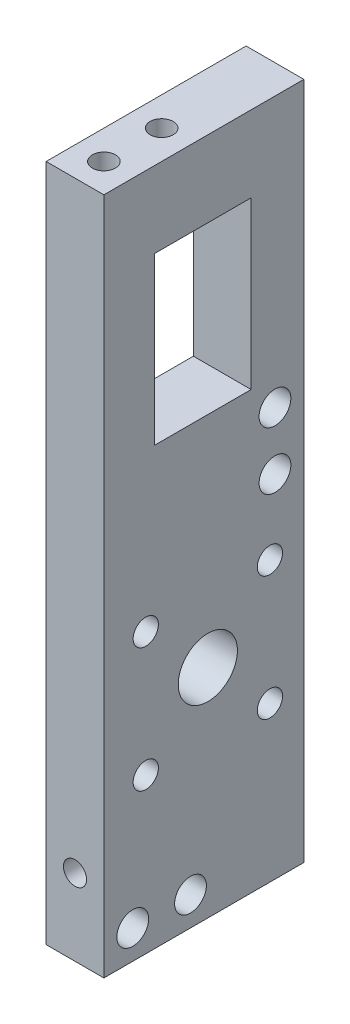
ISO-10303-21;
HEADER;
FILE_DESCRIPTION(('STEP AP214'),'2;1');
FILE_NAME('part.step','',(''),(''),'','','');
FILE_SCHEMA(('AUTOMOTIVE_DESIGN { 1 0 10303 214 1 1 1 1 }'));
ENDSEC;
DATA;
#1=APPLICATION_CONTEXT('core data for automotive mechanical design processes');
#2=APPLICATION_PROTOCOL_DEFINITION('international standard','automotive_design',2000,#1);
#3=PRODUCT_CONTEXT('',#1,'mechanical');
#4=PRODUCT('Part','Part','',(#3));
#5=PRODUCT_RELATED_PRODUCT_CATEGORY('part','',(#4));
#6=PRODUCT_DEFINITION_FORMATION('','',#4);
#7=PRODUCT_DEFINITION_CONTEXT('part definition',#1,'design');
#8=PRODUCT_DEFINITION('design','',#6,#7);
#9=PRODUCT_DEFINITION_SHAPE('','',#8);
#10=(LENGTH_UNIT() NAMED_UNIT(*) SI_UNIT(.MILLI.,.METRE.));
#11=(NAMED_UNIT(*) PLANE_ANGLE_UNIT() SI_UNIT($,.RADIAN.));
#12=(NAMED_UNIT(*) SI_UNIT($,.STERADIAN.) SOLID_ANGLE_UNIT());
#13=UNCERTAINTY_MEASURE_WITH_UNIT(LENGTH_MEASURE(1.E-05),#10,'distance_accuracy_value','');
#14=(GEOMETRIC_REPRESENTATION_CONTEXT(3) GLOBAL_UNCERTAINTY_ASSIGNED_CONTEXT((#13)) GLOBAL_UNIT_ASSIGNED_CONTEXT((#10,
#11,#12)) REPRESENTATION_CONTEXT('',''));
#15=CARTESIAN_POINT('',(0.,0.,0.));
#16=DIRECTION('',(0.,0.,1.));
#17=DIRECTION('',(1.,0.,0.));
#18=AXIS2_PLACEMENT_3D('',#15,#16,#17);
#19=CARTESIAN_POINT('',(49.65,-4.3,11.1));
#20=DIRECTION('',(1.,0.,0.));
#21=DIRECTION('',(0.,0.,-1.));
#22=AXIS2_PLACEMENT_3D('',#19,#20,#21);
#23=PLANE('',#22);
#24=CARTESIAN_POINT('',(49.65,20.,-0.75));
#25=DIRECTION('',(1.,0.,0.));
#26=DIRECTION('',(0.,0.,-1.));
#27=AXIS2_PLACEMENT_3D('',#24,#25,#26);
#28=CIRCLE('',#27,1.1);
#29=CARTESIAN_POINT('',(49.65,20.,-1.85));
#30=VERTEX_POINT('',#29);
#31=EDGE_CURVE('E131',#30,#30,#28,.T.);
#32=ORIENTED_EDGE('',*,*,#31,.T.);
#33=EDGE_LOOP('',(#32));
#34=FACE_BOUND('',#33,.T.);
#35=CARTESIAN_POINT('',(49.65,24.,-0.75));
#36=DIRECTION('',(1.,0.,0.));
#37=DIRECTION('',(0.,0.,-1.));
#38=AXIS2_PLACEMENT_3D('',#35,#36,#37);
#39=CIRCLE('',#38,1.1);
#40=CARTESIAN_POINT('',(49.65,24.,-1.85));
#41=VERTEX_POINT('',#40);
#42=EDGE_CURVE('E134',#41,#41,#39,.T.);
#43=ORIENTED_EDGE('',*,*,#42,.T.);
#44=EDGE_LOOP('',(#43));
#45=FACE_BOUND('',#44,.T.);
#46=CARTESIAN_POINT('',(49.65,6.425,-0.4005036727));
#47=DIRECTION('',(1.,0.,0.));
#48=DIRECTION('',(0.,0.,-1.));
#49=AXIS2_PLACEMENT_3D('',#46,#47,#48);
#50=CIRCLE('',#49,0.875);
#51=CARTESIAN_POINT('',(49.65,6.425,-1.2755036727));
#52=VERTEX_POINT('',#51);
#53=EDGE_CURVE('E150',#52,#52,#50,.T.);
#54=ORIENTED_EDGE('',*,*,#53,.T.);
#55=EDGE_LOOP('',(#54));
#56=FACE_BOUND('',#55,.T.);
#57=CARTESIAN_POINT('',(49.65,15.025,-0.4005036727));
#58=DIRECTION('',(1.,0.,0.));
#59=DIRECTION('',(0.,0.,-1.));
#60=AXIS2_PLACEMENT_3D('',#57,#58,#59);
#61=CIRCLE('',#60,0.875);
#62=CARTESIAN_POINT('',(49.65,15.025,-1.2755036727));
#63=VERTEX_POINT('',#62);
#64=EDGE_CURVE('E145',#63,#63,#61,.T.);
#65=ORIENTED_EDGE('',*,*,#64,.T.);
#66=EDGE_LOOP('',(#65));
#67=FACE_BOUND('',#66,.T.);
#68=CARTESIAN_POINT('',(49.65,10.725,3.8994963273));
#69=DIRECTION('',(1.,0.,0.));
#70=DIRECTION('',(0.,0.,-1.));
#71=AXIS2_PLACEMENT_3D('',#68,#69,#70);
#72=CIRCLE('',#71,2.05);
#73=CARTESIAN_POINT('',(49.65,10.725,1.8494963273));
#74=VERTEX_POINT('',#73);
#75=EDGE_CURVE('E215',#74,#74,#72,.T.);
#76=ORIENTED_EDGE('',*,*,#75,.T.);
#77=EDGE_LOOP('',(#76));
#78=FACE_BOUND('',#77,.T.);
#79=DIRECTION('',(0.,0.,-1.));
#80=VECTOR('',#79,1.);
#81=CARTESIAN_POINT('',(49.65,25.9,0.9));
#82=LINE('',#81,#80);
#83=CARTESIAN_POINT('',(49.65,25.9,7.6));
#84=VERTEX_POINT('',#83);
#85=CARTESIAN_POINT('',(49.65,25.9,0.9));
#86=VERTEX_POINT('',#85);
#87=EDGE_CURVE('E194',#84,#86,#82,.T.);
#88=ORIENTED_EDGE('',*,*,#87,.T.);
#89=DIRECTION('',(0.,1.,0.));
#90=VECTOR('',#89,1.);
#91=CARTESIAN_POINT('',(49.65,-4.3,0.9));
#92=LINE('',#91,#90);
#93=CARTESIAN_POINT('',(49.65,37.4,0.9));
#94=VERTEX_POINT('',#93);
#95=EDGE_CURVE('E138',#86,#94,#92,.T.);
#96=ORIENTED_EDGE('',*,*,#95,.T.);
#97=DIRECTION('',(0.,0.,1.));
#98=VECTOR('',#97,1.);
#99=CARTESIAN_POINT('',(49.65,37.4,0.9));
#100=LINE('',#99,#98);
#101=CARTESIAN_POINT('',(49.65,37.4,7.6));
#102=VERTEX_POINT('',#101);
#103=EDGE_CURVE('E122',#94,#102,#100,.T.);
#104=ORIENTED_EDGE('',*,*,#103,.T.);
#105=DIRECTION('',(0.,-1.,0.));
#106=VECTOR('',#105,1.);
#107=CARTESIAN_POINT('',(49.65,25.9,7.6));
#108=LINE('',#107,#106);
#109=EDGE_CURVE('E190',#102,#84,#108,.T.);
#110=ORIENTED_EDGE('',*,*,#109,.T.);
#111=EDGE_LOOP('',(#88,#96,#104,#110));
#112=FACE_BOUND('',#111,.T.);
#113=CARTESIAN_POINT('',(49.65,-2.3,5.1));
#114=DIRECTION('',(1.,0.,0.));
#115=DIRECTION('',(0.,0.,-1.));
#116=AXIS2_PLACEMENT_3D('',#113,#114,#115);
#117=CIRCLE('',#116,1.1);
#118=CARTESIAN_POINT('',(49.65,-2.3,4.));
#119=VERTEX_POINT('',#118);
#120=EDGE_CURVE('E178',#119,#119,#117,.T.);
#121=ORIENTED_EDGE('',*,*,#120,.T.);
#122=EDGE_LOOP('',(#121));
#123=FACE_BOUND('',#122,.T.);
#124=CARTESIAN_POINT('',(49.65,-2.3,9.1));
#125=DIRECTION('',(1.,0.,0.));
#126=DIRECTION('',(0.,0.,-1.));
#127=AXIS2_PLACEMENT_3D('',#124,#125,#126);
#128=CIRCLE('',#127,1.1);
#129=CARTESIAN_POINT('',(49.65,-2.3,8.));
#130=VERTEX_POINT('',#129);
#131=EDGE_CURVE('E169',#130,#130,#128,.T.);
#132=ORIENTED_EDGE('',*,*,#131,.T.);
#133=EDGE_LOOP('',(#132));
#134=FACE_BOUND('',#133,.T.);
#135=CARTESIAN_POINT('',(49.65,6.425,8.1994963273));
#136=DIRECTION('',(1.,0.,0.));
#137=DIRECTION('',(0.,0.,-1.));
#138=AXIS2_PLACEMENT_3D('',#135,#136,#137);
#139=CIRCLE('',#138,0.875);
#140=CARTESIAN_POINT('',(49.65,6.425,7.3244963273));
#141=VERTEX_POINT('',#140);
#142=EDGE_CURVE('E203',#141,#141,#139,.T.);
#143=ORIENTED_EDGE('',*,*,#142,.T.);
#144=EDGE_LOOP('',(#143));
#145=FACE_BOUND('',#144,.T.);
#146=CARTESIAN_POINT('',(49.65,15.025,8.1994963273));
#147=DIRECTION('',(1.,0.,0.));
#148=DIRECTION('',(0.,0.,-1.));
#149=AXIS2_PLACEMENT_3D('',#146,#147,#148);
#150=CIRCLE('',#149,0.875);
#151=CARTESIAN_POINT('',(49.65,15.025,7.3244963273));
#152=VERTEX_POINT('',#151);
#153=EDGE_CURVE('E201',#152,#152,#150,.T.);
#154=ORIENTED_EDGE('',*,*,#153,.T.);
#155=EDGE_LOOP('',(#154));
#156=FACE_BOUND('',#155,.T.);
#157=DIRECTION('',(0.,0.,-1.));
#158=VECTOR('',#157,1.);
#159=CARTESIAN_POINT('',(49.65,42.68,11.1));
#160=LINE('',#159,#158);
#161=CARTESIAN_POINT('',(49.65,42.68,11.1));
#162=VERTEX_POINT('',#161);
#163=CARTESIAN_POINT('',(49.65,42.68,-2.751909565512));
#164=VERTEX_POINT('',#163);
#165=EDGE_CURVE('E232',#162,#164,#160,.T.);
#166=ORIENTED_EDGE('',*,*,#165,.T.);
#167=DIRECTION('',(0.,1.,0.));
#168=VECTOR('',#167,1.);
#169=CARTESIAN_POINT('',(49.65,-4.3,-2.751909565512));
#170=LINE('',#169,#168);
#171=CARTESIAN_POINT('',(49.65,-4.3,-2.751909565512));
#172=VERTEX_POINT('',#171);
#173=EDGE_CURVE('E153',#172,#164,#170,.T.);
#174=ORIENTED_EDGE('',*,*,#173,.F.);
#175=DIRECTION('',(0.,0.,-1.));
#176=VECTOR('',#175,1.);
#177=CARTESIAN_POINT('',(49.65,-4.3,11.1));
#178=LINE('',#177,#176);
#179=CARTESIAN_POINT('',(49.65,-4.3,11.1));
#180=VERTEX_POINT('',#179);
#181=EDGE_CURVE('E52',#180,#172,#178,.T.);
#182=ORIENTED_EDGE('',*,*,#181,.F.);
#183=DIRECTION('',(0.,-1.,0.));
#184=VECTOR('',#183,1.);
#185=CARTESIAN_POINT('',(49.65,-4.3,11.1));
#186=LINE('',#185,#184);
#187=EDGE_CURVE('E224',#162,#180,#186,.T.);
#188=ORIENTED_EDGE('',*,*,#187,.F.);
#189=EDGE_LOOP('',(#166,#174,#182,#188));
#190=FACE_BOUND('',#189,.T.);
#191=ADVANCED_FACE('F45',(#34,#45,#56,#67,#78,#112,#123,#134,#145,#156,#190),#23,.F.);
#192=CARTESIAN_POINT('',(49.65,-4.3,11.1));
#193=DIRECTION('',(0.,1.,0.));
#194=DIRECTION('',(0.,0.,1.));
#195=AXIS2_PLACEMENT_3D('',#192,#193,#194);
#196=PLANE('',#195);
#197=ORIENTED_EDGE('',*,*,#181,.T.);
#198=DIRECTION('',(-1.,0.,0.));
#199=VECTOR('',#198,1.);
#200=CARTESIAN_POINT('',(49.65,-4.3,-2.751909565512));
#201=LINE('',#200,#199);
#202=CARTESIAN_POINT('',(53.65,-4.3,-2.751909565512));
#203=VERTEX_POINT('',#202);
#204=EDGE_CURVE('E162',#203,#172,#201,.T.);
#205=ORIENTED_EDGE('',*,*,#204,.F.);
#206=DIRECTION('',(0.,0.,-1.));
#207=VECTOR('',#206,1.);
#208=CARTESIAN_POINT('',(53.65,-4.3,11.1));
#209=LINE('',#208,#207);
#210=CARTESIAN_POINT('',(53.65,-4.3,11.1));
#211=VERTEX_POINT('',#210);
#212=EDGE_CURVE('E236',#211,#203,#209,.T.);
#213=ORIENTED_EDGE('',*,*,#212,.F.);
#214=DIRECTION('',(1.,0.,0.));
#215=VECTOR('',#214,1.);
#216=CARTESIAN_POINT('',(49.65,-4.3,11.1));
#217=LINE('',#216,#215);
#218=EDGE_CURVE('E228',#180,#211,#217,.T.);
#219=ORIENTED_EDGE('',*,*,#218,.F.);
#220=EDGE_LOOP('',(#197,#205,#213,#219));
#221=FACE_BOUND('',#220,.T.);
#222=ADVANCED_FACE('F240',(#221),#196,.F.);
#223=CARTESIAN_POINT('',(53.65,-4.3,11.1));
#224=DIRECTION('',(-1.,0.,0.));
#225=DIRECTION('',(0.,0.,1.));
#226=AXIS2_PLACEMENT_3D('',#223,#224,#225);
#227=PLANE('',#226);
#228=CARTESIAN_POINT('',(53.65,20.,-0.75));
#229=DIRECTION('',(1.,0.,0.));
#230=DIRECTION('',(0.,0.,-1.));
#231=AXIS2_PLACEMENT_3D('',#228,#229,#230);
#232=CIRCLE('',#231,1.1);
#233=CARTESIAN_POINT('',(53.65,20.,-1.85));
#234=VERTEX_POINT('',#233);
#235=EDGE_CURVE('E519',#234,#234,#232,.T.);
#236=ORIENTED_EDGE('',*,*,#235,.F.);
#237=EDGE_LOOP('',(#236));
#238=FACE_BOUND('',#237,.T.);
#239=CARTESIAN_POINT('',(53.65,24.,-0.75));
#240=DIRECTION('',(1.,0.,0.));
#241=DIRECTION('',(0.,0.,-1.));
#242=AXIS2_PLACEMENT_3D('',#239,#240,#241);
#243=CIRCLE('',#242,1.1);
#244=CARTESIAN_POINT('',(53.65,24.,-1.85));
#245=VERTEX_POINT('',#244);
#246=EDGE_CURVE('E520',#245,#245,#243,.T.);
#247=ORIENTED_EDGE('',*,*,#246,.F.);
#248=EDGE_LOOP('',(#247));
#249=FACE_BOUND('',#248,.T.);
#250=CARTESIAN_POINT('',(53.65,6.425,-0.4005036727));
#251=DIRECTION('',(1.,0.,0.));
#252=DIRECTION('',(0.,0.,-1.));
#253=AXIS2_PLACEMENT_3D('',#250,#251,#252);
#254=CIRCLE('',#253,0.875);
#255=CARTESIAN_POINT('',(53.65,6.425,-1.2755036727));
#256=VERTEX_POINT('',#255);
#257=EDGE_CURVE('E142',#256,#256,#254,.T.);
#258=ORIENTED_EDGE('',*,*,#257,.F.);
#259=EDGE_LOOP('',(#258));
#260=FACE_BOUND('',#259,.T.);
#261=CARTESIAN_POINT('',(53.65,15.025,-0.4005036727));
#262=DIRECTION('',(1.,0.,0.));
#263=DIRECTION('',(0.,0.,-1.));
#264=AXIS2_PLACEMENT_3D('',#261,#262,#263);
#265=CIRCLE('',#264,0.875);
#266=CARTESIAN_POINT('',(53.65,15.025,-1.2755036727));
#267=VERTEX_POINT('',#266);
#268=EDGE_CURVE('E141',#267,#267,#265,.T.);
#269=ORIENTED_EDGE('',*,*,#268,.F.);
#270=EDGE_LOOP('',(#269));
#271=FACE_BOUND('',#270,.T.);
#272=DIRECTION('',(0.,-1.,0.));
#273=VECTOR('',#272,1.);
#274=CARTESIAN_POINT('',(53.65,-4.3,-2.751909565512));
#275=LINE('',#274,#273);
#276=CARTESIAN_POINT('',(53.65,42.68,-2.751909565512));
#277=VERTEX_POINT('',#276);
#278=EDGE_CURVE('E159',#277,#203,#275,.T.);
#279=ORIENTED_EDGE('',*,*,#278,.F.);
#280=DIRECTION('',(0.,0.,-1.));
#281=VECTOR('',#280,1.);
#282=CARTESIAN_POINT('',(53.65,42.68,11.1));
#283=LINE('',#282,#281);
#284=CARTESIAN_POINT('',(53.65,42.68,11.1));
#285=VERTEX_POINT('',#284);
#286=EDGE_CURVE('E234',#285,#277,#283,.T.);
#287=ORIENTED_EDGE('',*,*,#286,.F.);
#288=DIRECTION('',(0.,1.,0.));
#289=VECTOR('',#288,1.);
#290=CARTESIAN_POINT('',(53.65,-4.3,11.1));
#291=LINE('',#290,#289);
#292=EDGE_CURVE('E64',#211,#285,#291,.T.);
#293=ORIENTED_EDGE('',*,*,#292,.F.);
#294=ORIENTED_EDGE('',*,*,#212,.T.);
#295=EDGE_LOOP('',(#279,#287,#293,#294));
#296=FACE_BOUND('',#295,.T.);
#297=DIRECTION('',(0.,1.,0.));
#298=VECTOR('',#297,1.);
#299=CARTESIAN_POINT('',(53.65,25.9,0.9));
#300=LINE('',#299,#298);
#301=CARTESIAN_POINT('',(53.65,25.9,0.9));
#302=VERTEX_POINT('',#301);
#303=CARTESIAN_POINT('',(53.65,37.4,0.9));
#304=VERTEX_POINT('',#303);
#305=EDGE_CURVE('E113',#302,#304,#300,.T.);
#306=ORIENTED_EDGE('',*,*,#305,.F.);
#307=DIRECTION('',(0.,0.,-1.));
#308=VECTOR('',#307,1.);
#309=CARTESIAN_POINT('',(53.65,25.9,0.9));
#310=LINE('',#309,#308);
#311=CARTESIAN_POINT('',(53.65,25.9,7.6));
#312=VERTEX_POINT('',#311);
#313=EDGE_CURVE('E191',#312,#302,#310,.T.);
#314=ORIENTED_EDGE('',*,*,#313,.F.);
#315=DIRECTION('',(0.,-1.,0.));
#316=VECTOR('',#315,1.);
#317=CARTESIAN_POINT('',(53.65,25.9,7.6));
#318=LINE('',#317,#316);
#319=CARTESIAN_POINT('',(53.65,37.4,7.6));
#320=VERTEX_POINT('',#319);
#321=EDGE_CURVE('E115',#320,#312,#318,.T.);
#322=ORIENTED_EDGE('',*,*,#321,.F.);
#323=DIRECTION('',(0.,0.,-1.));
#324=VECTOR('',#323,1.);
#325=CARTESIAN_POINT('',(53.65,37.4,11.1));
#326=LINE('',#325,#324);
#327=EDGE_CURVE('E11',#320,#304,#326,.T.);
#328=ORIENTED_EDGE('',*,*,#327,.T.);
#329=EDGE_LOOP('',(#306,#314,#322,#328));
#330=FACE_BOUND('',#329,.T.);
#331=CARTESIAN_POINT('',(53.65,-2.3,5.1));
#332=DIRECTION('',(1.,0.,0.));
#333=DIRECTION('',(0.,0.,-1.));
#334=AXIS2_PLACEMENT_3D('',#331,#332,#333);
#335=CIRCLE('',#334,1.1);
#336=CARTESIAN_POINT('',(53.65,-2.3,4.));
#337=VERTEX_POINT('',#336);
#338=EDGE_CURVE('E181',#337,#337,#335,.T.);
#339=ORIENTED_EDGE('',*,*,#338,.F.);
#340=EDGE_LOOP('',(#339));
#341=FACE_BOUND('',#340,.T.);
#342=CARTESIAN_POINT('',(53.65,-2.3,9.1));
#343=DIRECTION('',(1.,0.,0.));
#344=DIRECTION('',(0.,0.,-1.));
#345=AXIS2_PLACEMENT_3D('',#342,#343,#344);
#346=CIRCLE('',#345,1.1);
#347=CARTESIAN_POINT('',(53.65,-2.3,8.));
#348=VERTEX_POINT('',#347);
#349=EDGE_CURVE('E184',#348,#348,#346,.T.);
#350=ORIENTED_EDGE('',*,*,#349,.F.);
#351=EDGE_LOOP('',(#350));
#352=FACE_BOUND('',#351,.T.);
#353=CARTESIAN_POINT('',(53.65,6.425,8.1994963273));
#354=DIRECTION('',(1.,0.,0.));
#355=DIRECTION('',(0.,0.,-1.));
#356=AXIS2_PLACEMENT_3D('',#353,#354,#355);
#357=CIRCLE('',#356,0.875);
#358=CARTESIAN_POINT('',(53.65,6.425,7.3244963273));
#359=VERTEX_POINT('',#358);
#360=EDGE_CURVE('E207',#359,#359,#357,.T.);
#361=ORIENTED_EDGE('',*,*,#360,.F.);
#362=EDGE_LOOP('',(#361));
#363=FACE_BOUND('',#362,.T.);
#364=CARTESIAN_POINT('',(53.65,15.025,8.1994963273));
#365=DIRECTION('',(1.,0.,0.));
#366=DIRECTION('',(0.,0.,-1.));
#367=AXIS2_PLACEMENT_3D('',#364,#365,#366);
#368=CIRCLE('',#367,0.875);
#369=CARTESIAN_POINT('',(53.65,15.025,7.3244963273));
#370=VERTEX_POINT('',#369);
#371=EDGE_CURVE('E210',#370,#370,#368,.T.);
#372=ORIENTED_EDGE('',*,*,#371,.F.);
#373=EDGE_LOOP('',(#372));
#374=FACE_BOUND('',#373,.T.);
#375=CARTESIAN_POINT('',(53.65,10.725,3.8994963273));
#376=DIRECTION('',(1.,0.,0.));
#377=DIRECTION('',(0.,0.,-1.));
#378=AXIS2_PLACEMENT_3D('',#375,#376,#377);
#379=CIRCLE('',#378,2.05);
#380=CARTESIAN_POINT('',(53.65,10.725,1.8494963273));
#381=VERTEX_POINT('',#380);
#382=EDGE_CURVE('E206',#381,#381,#379,.T.);
#383=ORIENTED_EDGE('',*,*,#382,.F.);
#384=EDGE_LOOP('',(#383));
#385=FACE_BOUND('',#384,.T.);
#386=ADVANCED_FACE('F109',(#238,#249,#260,#271,#296,#330,#341,#352,#363,#374,#385),#227,.F.);
#387=CARTESIAN_POINT('',(49.65,42.68,11.1));
#388=DIRECTION('',(0.,-1.,0.));
#389=DIRECTION('',(0.,0.,-1.));
#390=AXIS2_PLACEMENT_3D('',#387,#388,#389);
#391=PLANE('',#390);
#392=CARTESIAN_POINT('',(51.65,42.68,5.1));
#393=DIRECTION('',(0.,1.,0.));
#394=DIRECTION('',(0.,0.,1.));
#395=AXIS2_PLACEMENT_3D('',#392,#393,#394);
#396=CIRCLE('',#395,0.800000000000002);
#397=CARTESIAN_POINT('',(51.65,42.68,5.9));
#398=VERTEX_POINT('',#397);
#399=EDGE_CURVE('E170',#398,#398,#396,.T.);
#400=ORIENTED_EDGE('',*,*,#399,.F.);
#401=EDGE_LOOP('',(#400));
#402=FACE_BOUND('',#401,.T.);
#403=CARTESIAN_POINT('',(51.65,42.68,9.1));
#404=DIRECTION('',(0.,1.,0.));
#405=DIRECTION('',(0.,0.,1.));
#406=AXIS2_PLACEMENT_3D('',#403,#404,#405);
#407=CIRCLE('',#406,0.800000000000002);
#408=CARTESIAN_POINT('',(51.65,42.68,9.9));
#409=VERTEX_POINT('',#408);
#410=EDGE_CURVE('E173',#409,#409,#407,.T.);
#411=ORIENTED_EDGE('',*,*,#410,.F.);
#412=EDGE_LOOP('',(#411));
#413=FACE_BOUND('',#412,.T.);
#414=ORIENTED_EDGE('',*,*,#286,.T.);
#415=DIRECTION('',(1.,0.,0.));
#416=VECTOR('',#415,1.);
#417=CARTESIAN_POINT('',(49.65,42.68,-2.751909565512));
#418=LINE('',#417,#416);
#419=EDGE_CURVE('E156',#164,#277,#418,.T.);
#420=ORIENTED_EDGE('',*,*,#419,.F.);
#421=ORIENTED_EDGE('',*,*,#165,.F.);
#422=DIRECTION('',(-1.,0.,0.));
#423=VECTOR('',#422,1.);
#424=CARTESIAN_POINT('',(49.65,42.68,11.1));
#425=LINE('',#424,#423);
#426=EDGE_CURVE('E59',#285,#162,#425,.T.);
#427=ORIENTED_EDGE('',*,*,#426,.F.);
#428=EDGE_LOOP('',(#414,#420,#421,#427));
#429=FACE_BOUND('',#428,.T.);
#430=ADVANCED_FACE('F250',(#402,#413,#429),#391,.F.);
#431=CARTESIAN_POINT('',(0.,0.,11.1));
#432=DIRECTION('',(0.,0.,-1.));
#433=DIRECTION('',(-1.,0.,0.));
#434=AXIS2_PLACEMENT_3D('',#431,#432,#433);
#435=PLANE('',#434);
#436=CARTESIAN_POINT('',(51.65,1.,11.1));
#437=DIRECTION('',(0.,0.,1.));
#438=DIRECTION('',(1.,0.,0.));
#439=AXIS2_PLACEMENT_3D('',#436,#437,#438);
#440=CIRCLE('',#439,0.800000000000002);
#441=CARTESIAN_POINT('',(52.45,1.,11.1));
#442=VERTEX_POINT('',#441);
#443=EDGE_CURVE('E218',#442,#442,#440,.T.);
#444=ORIENTED_EDGE('',*,*,#443,.F.);
#445=EDGE_LOOP('',(#444));
#446=FACE_BOUND('',#445,.T.);
#447=ORIENTED_EDGE('',*,*,#187,.T.);
#448=ORIENTED_EDGE('',*,*,#218,.T.);
#449=ORIENTED_EDGE('',*,*,#292,.T.);
#450=ORIENTED_EDGE('',*,*,#426,.T.);
#451=EDGE_LOOP('',(#447,#448,#449,#450));
#452=FACE_BOUND('',#451,.T.);
#453=ADVANCED_FACE('F260',(#446,#452),#435,.F.);
#454=CARTESIAN_POINT('',(51.65,1.,2.248090434488));
#455=DIRECTION('',(0.,0.,1.));
#456=DIRECTION('',(1.,0.,0.));
#457=AXIS2_PLACEMENT_3D('',#454,#455,#456);
#458=CYLINDRICAL_SURFACE('',#457,0.800000000000002);
#459=CARTESIAN_POINT('',(51.65,1.,2.248090434488));
#460=DIRECTION('',(0.,0.,1.));
#461=DIRECTION('',(1.,0.,0.));
#462=AXIS2_PLACEMENT_3D('',#459,#460,#461);
#463=CIRCLE('',#462,0.800000000000002);
#464=CARTESIAN_POINT('',(52.45,1.,2.248090434488));
#465=VERTEX_POINT('',#464);
#466=EDGE_CURVE('E221',#465,#465,#463,.T.);
#467=ORIENTED_EDGE('',*,*,#466,.F.);
#468=EDGE_LOOP('',(#467));
#469=FACE_BOUND('',#468,.T.);
#470=ORIENTED_EDGE('',*,*,#443,.T.);
#471=EDGE_LOOP('',(#470));
#472=FACE_BOUND('',#471,.T.);
#473=ADVANCED_FACE('F304',(#469,#472),#458,.F.);
#474=CARTESIAN_POINT('',(49.65,10.725,3.8994963273));
#475=DIRECTION('',(1.,0.,0.));
#476=DIRECTION('',(0.,0.,-1.));
#477=AXIS2_PLACEMENT_3D('',#474,#475,#476);
#478=CYLINDRICAL_SURFACE('',#477,2.05);
#479=ORIENTED_EDGE('',*,*,#382,.T.);
#480=EDGE_LOOP('',(#479));
#481=FACE_BOUND('',#480,.T.);
#482=ORIENTED_EDGE('',*,*,#75,.F.);
#483=EDGE_LOOP('',(#482));
#484=FACE_BOUND('',#483,.T.);
#485=ADVANCED_FACE('F295',(#481,#484),#478,.F.);
#486=CARTESIAN_POINT('',(49.65,15.025,8.1994963273));
#487=DIRECTION('',(1.,0.,0.));
#488=DIRECTION('',(0.,0.,-1.));
#489=AXIS2_PLACEMENT_3D('',#486,#487,#488);
#490=CYLINDRICAL_SURFACE('',#489,0.875);
#491=ORIENTED_EDGE('',*,*,#153,.F.);
#492=EDGE_LOOP('',(#491));
#493=FACE_BOUND('',#492,.T.);
#494=ORIENTED_EDGE('',*,*,#371,.T.);
#495=EDGE_LOOP('',(#494));
#496=FACE_BOUND('',#495,.T.);
#497=ADVANCED_FACE('F291',(#493,#496),#490,.F.);
#498=CARTESIAN_POINT('',(49.65,6.425,8.1994963273));
#499=DIRECTION('',(1.,0.,0.));
#500=DIRECTION('',(0.,0.,-1.));
#501=AXIS2_PLACEMENT_3D('',#498,#499,#500);
#502=CYLINDRICAL_SURFACE('',#501,0.875);
#503=ORIENTED_EDGE('',*,*,#142,.F.);
#504=EDGE_LOOP('',(#503));
#505=FACE_BOUND('',#504,.T.);
#506=ORIENTED_EDGE('',*,*,#360,.T.);
#507=EDGE_LOOP('',(#506));
#508=FACE_BOUND('',#507,.T.);
#509=ADVANCED_FACE('F294',(#505,#508),#502,.F.);
#510=CARTESIAN_POINT('',(49.65,25.9,0.9));
#511=DIRECTION('',(0.,-1.,0.));
#512=DIRECTION('',(0.,0.,-1.));
#513=AXIS2_PLACEMENT_3D('',#510,#511,#512);
#514=PLANE('',#513);
#515=ORIENTED_EDGE('',*,*,#313,.T.);
#516=DIRECTION('',(1.,0.,0.));
#517=VECTOR('',#516,1.);
#518=CARTESIAN_POINT('',(49.64,25.9,0.9));
#519=LINE('',#518,#517);
#520=EDGE_CURVE('E126',#86,#302,#519,.T.);
#521=ORIENTED_EDGE('',*,*,#520,.F.);
#522=ORIENTED_EDGE('',*,*,#87,.F.);
#523=DIRECTION('',(1.,0.,0.));
#524=VECTOR('',#523,1.);
#525=CARTESIAN_POINT('',(49.65,25.9,7.6));
#526=LINE('',#525,#524);
#527=EDGE_CURVE('E199',#84,#312,#526,.T.);
#528=ORIENTED_EDGE('',*,*,#527,.T.);
#529=EDGE_LOOP('',(#515,#521,#522,#528));
#530=FACE_BOUND('',#529,.T.);
#531=ADVANCED_FACE('F345',(#530),#514,.F.);
#532=CARTESIAN_POINT('',(49.65,25.9,7.6));
#533=DIRECTION('',(0.,0.,1.));
#534=DIRECTION('',(1.,0.,0.));
#535=AXIS2_PLACEMENT_3D('',#532,#533,#534);
#536=PLANE('',#535);
#537=ORIENTED_EDGE('',*,*,#321,.T.);
#538=ORIENTED_EDGE('',*,*,#527,.F.);
#539=ORIENTED_EDGE('',*,*,#109,.F.);
#540=DIRECTION('',(1.,0.,0.));
#541=VECTOR('',#540,1.);
#542=CARTESIAN_POINT('',(49.65,37.4,7.6));
#543=LINE('',#542,#541);
#544=EDGE_CURVE('E196',#102,#320,#543,.T.);
#545=ORIENTED_EDGE('',*,*,#544,.T.);
#546=EDGE_LOOP('',(#537,#538,#539,#545));
#547=FACE_BOUND('',#546,.T.);
#548=ADVANCED_FACE('F353',(#547),#536,.F.);
#549=CARTESIAN_POINT('',(49.65,37.4,0.9));
#550=DIRECTION('',(0.,1.,0.));
#551=DIRECTION('',(0.,0.,1.));
#552=AXIS2_PLACEMENT_3D('',#549,#550,#551);
#553=PLANE('',#552);
#554=ORIENTED_EDGE('',*,*,#103,.F.);
#555=DIRECTION('',(1.,0.,0.));
#556=VECTOR('',#555,1.);
#557=CARTESIAN_POINT('',(49.64,37.4,0.9));
#558=LINE('',#557,#556);
#559=EDGE_CURVE('E119',#94,#304,#558,.T.);
#560=ORIENTED_EDGE('',*,*,#559,.T.);
#561=ORIENTED_EDGE('',*,*,#327,.F.);
#562=ORIENTED_EDGE('',*,*,#544,.F.);
#563=EDGE_LOOP('',(#554,#560,#561,#562));
#564=FACE_BOUND('',#563,.T.);
#565=ADVANCED_FACE('F120',(#564),#553,.F.);
#566=CARTESIAN_POINT('',(49.65,-2.3,9.1));
#567=DIRECTION('',(1.,0.,0.));
#568=DIRECTION('',(0.,0.,-1.));
#569=AXIS2_PLACEMENT_3D('',#566,#567,#568);
#570=CYLINDRICAL_SURFACE('',#569,1.1);
#571=ORIENTED_EDGE('',*,*,#131,.F.);
#572=EDGE_LOOP('',(#571));
#573=FACE_BOUND('',#572,.T.);
#574=ORIENTED_EDGE('',*,*,#349,.T.);
#575=EDGE_LOOP('',(#574));
#576=FACE_BOUND('',#575,.T.);
#577=ADVANCED_FACE('F363',(#573,#576),#570,.F.);
#578=CARTESIAN_POINT('',(49.65,-2.3,5.1));
#579=DIRECTION('',(1.,0.,0.));
#580=DIRECTION('',(0.,0.,-1.));
#581=AXIS2_PLACEMENT_3D('',#578,#579,#580);
#582=CYLINDRICAL_SURFACE('',#581,1.1);
#583=ORIENTED_EDGE('',*,*,#120,.F.);
#584=EDGE_LOOP('',(#583));
#585=FACE_BOUND('',#584,.T.);
#586=ORIENTED_EDGE('',*,*,#338,.T.);
#587=EDGE_LOOP('',(#586));
#588=FACE_BOUND('',#587,.T.);
#589=ADVANCED_FACE('F367',(#585,#588),#582,.F.);
#590=CARTESIAN_POINT('',(51.65,38.68,9.1));
#591=DIRECTION('',(0.,1.,0.));
#592=DIRECTION('',(0.,0.,1.));
#593=AXIS2_PLACEMENT_3D('',#590,#591,#592);
#594=CYLINDRICAL_SURFACE('',#593,0.800000000000002);
#595=CARTESIAN_POINT('',(51.65,38.68,9.1));
#596=DIRECTION('',(0.,1.,0.));
#597=DIRECTION('',(0.,0.,1.));
#598=AXIS2_PLACEMENT_3D('',#595,#596,#597);
#599=CIRCLE('',#598,0.800000000000002);
#600=CARTESIAN_POINT('',(51.65,38.68,9.9));
#601=VERTEX_POINT('',#600);
#602=EDGE_CURVE('E165',#601,#601,#599,.T.);
#603=ORIENTED_EDGE('',*,*,#602,.F.);
#604=EDGE_LOOP('',(#603));
#605=FACE_BOUND('',#604,.T.);
#606=ORIENTED_EDGE('',*,*,#410,.T.);
#607=EDGE_LOOP('',(#606));
#608=FACE_BOUND('',#607,.T.);
#609=ADVANCED_FACE('F376',(#605,#608),#594,.F.);
#610=CARTESIAN_POINT('',(51.65,38.68,9.1));
#611=DIRECTION('',(0.,1.,0.));
#612=DIRECTION('',(0.,0.,1.));
#613=AXIS2_PLACEMENT_3D('',#610,#611,#612);
#614=PLANE('',#613);
#615=ORIENTED_EDGE('',*,*,#602,.T.);
#616=EDGE_LOOP('',(#615));
#617=FACE_BOUND('',#616,.T.);
#618=ADVANCED_FACE('F386',(#617),#614,.T.);
#619=CARTESIAN_POINT('',(51.65,38.68,5.1));
#620=DIRECTION('',(0.,1.,0.));
#621=DIRECTION('',(0.,0.,1.));
#622=AXIS2_PLACEMENT_3D('',#619,#620,#621);
#623=CYLINDRICAL_SURFACE('',#622,0.800000000000002);
#624=CARTESIAN_POINT('',(51.65,38.68,5.1));
#625=DIRECTION('',(0.,1.,0.));
#626=DIRECTION('',(0.,0.,1.));
#627=AXIS2_PLACEMENT_3D('',#624,#625,#626);
#628=CIRCLE('',#627,0.800000000000002);
#629=CARTESIAN_POINT('',(51.65,38.68,5.9));
#630=VERTEX_POINT('',#629);
#631=EDGE_CURVE('E166',#630,#630,#628,.T.);
#632=ORIENTED_EDGE('',*,*,#631,.F.);
#633=EDGE_LOOP('',(#632));
#634=FACE_BOUND('',#633,.T.);
#635=ORIENTED_EDGE('',*,*,#399,.T.);
#636=EDGE_LOOP('',(#635));
#637=FACE_BOUND('',#636,.T.);
#638=ADVANCED_FACE('F397',(#634,#637),#623,.F.);
#639=CARTESIAN_POINT('',(51.65,38.68,5.1));
#640=DIRECTION('',(0.,1.,0.));
#641=DIRECTION('',(0.,0.,1.));
#642=AXIS2_PLACEMENT_3D('',#639,#640,#641);
#643=PLANE('',#642);
#644=ORIENTED_EDGE('',*,*,#631,.T.);
#645=EDGE_LOOP('',(#644));
#646=FACE_BOUND('',#645,.T.);
#647=ADVANCED_FACE('F407',(#646),#643,.T.);
#648=CARTESIAN_POINT('',(0.,0.,-2.751909565512));
#649=DIRECTION('',(0.,0.,-1.));
#650=DIRECTION('',(-1.,0.,0.));
#651=AXIS2_PLACEMENT_3D('',#648,#649,#650);
#652=PLANE('',#651);
#653=ORIENTED_EDGE('',*,*,#173,.T.);
#654=ORIENTED_EDGE('',*,*,#419,.T.);
#655=ORIENTED_EDGE('',*,*,#278,.T.);
#656=ORIENTED_EDGE('',*,*,#204,.T.);
#657=EDGE_LOOP('',(#653,#654,#655,#656));
#658=FACE_BOUND('',#657,.T.);
#659=ADVANCED_FACE('F246',(#658),#652,.T.);
#660=CARTESIAN_POINT('',(0.,0.,2.248090434488));
#661=DIRECTION('',(0.,0.,-1.));
#662=DIRECTION('',(-1.,0.,0.));
#663=AXIS2_PLACEMENT_3D('',#660,#661,#662);
#664=PLANE('',#663);
#665=ORIENTED_EDGE('',*,*,#466,.T.);
#666=EDGE_LOOP('',(#665));
#667=FACE_BOUND('',#666,.T.);
#668=ADVANCED_FACE('F434',(#667),#664,.F.);
#669=CARTESIAN_POINT('',(49.64,15.025,-0.4005036727));
#670=DIRECTION('',(1.,0.,0.));
#671=DIRECTION('',(0.,0.,-1.));
#672=AXIS2_PLACEMENT_3D('',#669,#670,#671);
#673=CYLINDRICAL_SURFACE('',#672,0.875);
#674=ORIENTED_EDGE('',*,*,#268,.T.);
#675=EDGE_LOOP('',(#674));
#676=FACE_BOUND('',#675,.T.);
#677=ORIENTED_EDGE('',*,*,#64,.F.);
#678=EDGE_LOOP('',(#677));
#679=FACE_BOUND('',#678,.T.);
#680=ADVANCED_FACE('F441',(#676,#679),#673,.F.);
#681=CARTESIAN_POINT('',(49.64,6.425,-0.4005036727));
#682=DIRECTION('',(1.,0.,0.));
#683=DIRECTION('',(0.,0.,-1.));
#684=AXIS2_PLACEMENT_3D('',#681,#682,#683);
#685=CYLINDRICAL_SURFACE('',#684,0.875);
#686=ORIENTED_EDGE('',*,*,#257,.T.);
#687=EDGE_LOOP('',(#686));
#688=FACE_BOUND('',#687,.T.);
#689=ORIENTED_EDGE('',*,*,#53,.F.);
#690=EDGE_LOOP('',(#689));
#691=FACE_BOUND('',#690,.T.);
#692=ADVANCED_FACE('F458',(#688,#691),#685,.F.);
#693=CARTESIAN_POINT('',(49.64,25.9,0.9));
#694=DIRECTION('',(0.,0.,-1.));
#695=DIRECTION('',(-1.,0.,0.));
#696=AXIS2_PLACEMENT_3D('',#693,#694,#695);
#697=PLANE('',#696);
#698=ORIENTED_EDGE('',*,*,#520,.T.);
#699=ORIENTED_EDGE('',*,*,#305,.T.);
#700=ORIENTED_EDGE('',*,*,#559,.F.);
#701=ORIENTED_EDGE('',*,*,#95,.F.);
#702=EDGE_LOOP('',(#698,#699,#700,#701));
#703=FACE_BOUND('',#702,.T.);
#704=ADVANCED_FACE('F129',(#703),#697,.F.);
#705=CARTESIAN_POINT('',(49.64,24.,-0.75));
#706=DIRECTION('',(1.,0.,0.));
#707=DIRECTION('',(0.,0.,-1.));
#708=AXIS2_PLACEMENT_3D('',#705,#706,#707);
#709=CYLINDRICAL_SURFACE('',#708,1.1);
#710=ORIENTED_EDGE('',*,*,#246,.T.);
#711=EDGE_LOOP('',(#710));
#712=FACE_BOUND('',#711,.T.);
#713=ORIENTED_EDGE('',*,*,#42,.F.);
#714=EDGE_LOOP('',(#713));
#715=FACE_BOUND('',#714,.T.);
#716=ADVANCED_FACE('F496',(#712,#715),#709,.F.);
#717=CARTESIAN_POINT('',(49.64,20.,-0.75));
#718=DIRECTION('',(1.,0.,0.));
#719=DIRECTION('',(0.,0.,-1.));
#720=AXIS2_PLACEMENT_3D('',#717,#718,#719);
#721=CYLINDRICAL_SURFACE('',#720,1.1);
#722=ORIENTED_EDGE('',*,*,#235,.T.);
#723=EDGE_LOOP('',(#722));
#724=FACE_BOUND('',#723,.T.);
#725=ORIENTED_EDGE('',*,*,#31,.F.);
#726=EDGE_LOOP('',(#725));
#727=FACE_BOUND('',#726,.T.);
#728=ADVANCED_FACE('F504',(#724,#727),#721,.F.);
#729=CLOSED_SHELL('',(#191,#222,#386,#430,#453,#473,#485,#497,#509,#531,#548,#565,#577,#589,
#609,#618,#638,#647,#659,#668,#680,#692,#704,#716,#728));
#730=MANIFOLD_SOLID_BREP('B2',#729);
#731=ADVANCED_BREP_SHAPE_REPRESENTATION('',(#18,#730),#14);
#732=SHAPE_DEFINITION_REPRESENTATION(#9,#731);
ENDSEC;
END-ISO-10303-21;
